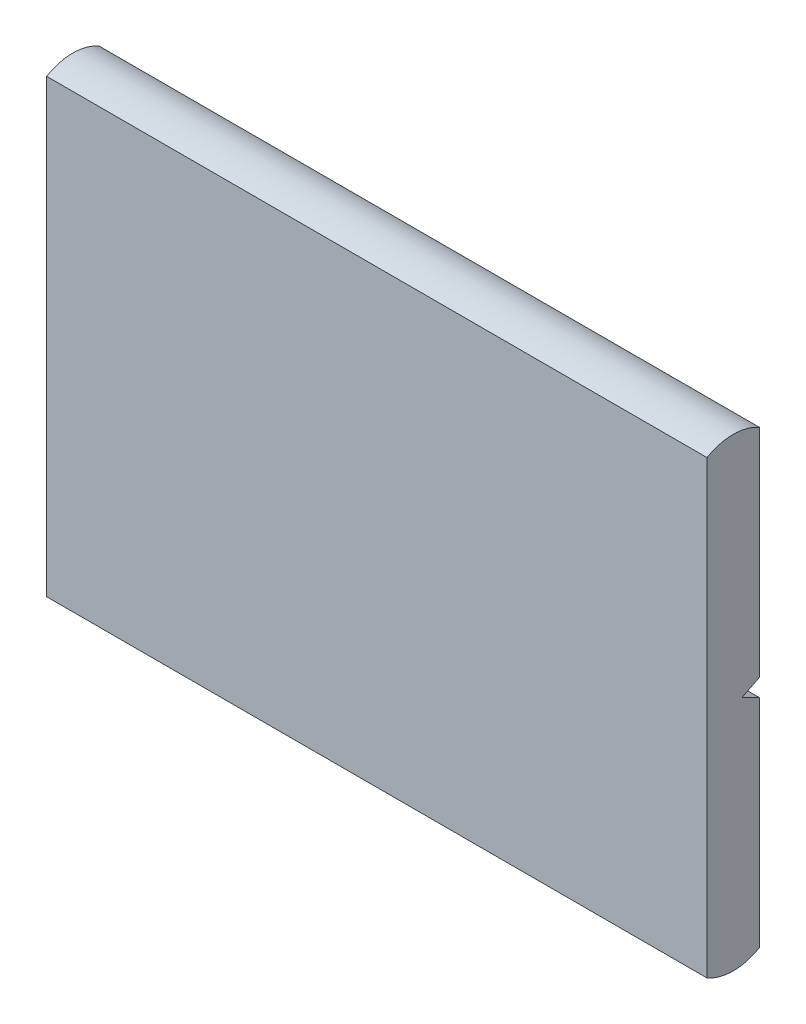
ISO-10303-21;
HEADER;
FILE_DESCRIPTION(('STEP AP214'),'2;1');
FILE_NAME('part.step','',(''),(''),'','','');
FILE_SCHEMA(('AUTOMOTIVE_DESIGN { 1 0 10303 214 1 1 1 1 }'));
ENDSEC;
DATA;
#1=APPLICATION_CONTEXT('core data for automotive mechanical design processes');
#2=APPLICATION_PROTOCOL_DEFINITION('international standard','automotive_design',2000,#1);
#3=PRODUCT_CONTEXT('',#1,'mechanical');
#4=PRODUCT('Part','Part','',(#3));
#5=PRODUCT_RELATED_PRODUCT_CATEGORY('part','',(#4));
#6=PRODUCT_DEFINITION_FORMATION('','',#4);
#7=PRODUCT_DEFINITION_CONTEXT('part definition',#1,'design');
#8=PRODUCT_DEFINITION('design','',#6,#7);
#9=PRODUCT_DEFINITION_SHAPE('','',#8);
#10=(LENGTH_UNIT() NAMED_UNIT(*) SI_UNIT(.MILLI.,.METRE.));
#11=(NAMED_UNIT(*) PLANE_ANGLE_UNIT() SI_UNIT($,.RADIAN.));
#12=(NAMED_UNIT(*) SI_UNIT($,.STERADIAN.) SOLID_ANGLE_UNIT());
#13=UNCERTAINTY_MEASURE_WITH_UNIT(LENGTH_MEASURE(1.E-05),#10,'distance_accuracy_value','');
#14=(GEOMETRIC_REPRESENTATION_CONTEXT(3) GLOBAL_UNCERTAINTY_ASSIGNED_CONTEXT((#13)) GLOBAL_UNIT_ASSIGNED_CONTEXT((#10,
#11,#12)) REPRESENTATION_CONTEXT('',''));
#15=CARTESIAN_POINT('',(0.,0.,0.));
#16=DIRECTION('',(0.,0.,1.));
#17=DIRECTION('',(1.,0.,0.));
#18=AXIS2_PLACEMENT_3D('',#15,#16,#17);
#19=CARTESIAN_POINT('',(-6.9,15.8207913991634,6.95841720167324));
#20=DIRECTION('',(0.,-0.894427190999916,-0.447213595499958));
#21=DIRECTION('',(0.,0.447213595499958,-0.894427190999916));
#22=AXIS2_PLACEMENT_3D('',#19,#20,#21);
#23=PLANE('',#22);
#24=DIRECTION('',(0.,0.447213595499958,-0.894427190999916));
#25=VECTOR('',#24,1.);
#26=CARTESIAN_POINT('',(-6.9,15.8207913991634,6.95841720167324));
#27=LINE('',#26,#25);
#28=CARTESIAN_POINT('',(-6.9,11.7,15.2));
#29=VERTEX_POINT('',#28);
#30=CARTESIAN_POINT('',(-6.9,11.95,14.7));
#31=VERTEX_POINT('',#30);
#32=EDGE_CURVE('E60',#29,#31,#27,.T.);
#33=ORIENTED_EDGE('',*,*,#32,.T.);
#34=DIRECTION('',(1.,0.,0.));
#35=VECTOR('',#34,1.);
#36=CARTESIAN_POINT('',(12.,11.95,14.7));
#37=LINE('',#36,#35);
#38=CARTESIAN_POINT('',(12.,11.95,14.7));
#39=VERTEX_POINT('',#38);
#40=EDGE_CURVE('E103',#31,#39,#37,.T.);
#41=ORIENTED_EDGE('',*,*,#40,.T.);
#42=DIRECTION('',(0.,0.447213595499958,-0.894427190999916));
#43=VECTOR('',#42,1.);
#44=CARTESIAN_POINT('',(12.,15.8207913991634,6.95841720167324));
#45=LINE('',#44,#43);
#46=CARTESIAN_POINT('',(12.,11.7,15.2));
#47=VERTEX_POINT('',#46);
#48=EDGE_CURVE('E148',#39,#47,#45,.F.);
#49=ORIENTED_EDGE('',*,*,#48,.T.);
#50=DIRECTION('',(1.,0.,0.));
#51=VECTOR('',#50,1.);
#52=CARTESIAN_POINT('',(-6.9,11.7,15.2));
#53=LINE('',#52,#51);
#54=EDGE_CURVE('E98',#29,#47,#53,.T.);
#55=ORIENTED_EDGE('',*,*,#54,.F.);
#56=EDGE_LOOP('',(#33,#41,#49,#55));
#57=FACE_BOUND('',#56,.T.);
#58=ADVANCED_FACE('F17',(#57),#23,.T.);
#59=CARTESIAN_POINT('',(-6.9,7.57920860083662,6.95841720167324));
#60=DIRECTION('',(0.,0.894427190999916,-0.447213595499958));
#61=DIRECTION('',(0.,0.447213595499958,0.894427190999916));
#62=AXIS2_PLACEMENT_3D('',#59,#60,#61);
#63=PLANE('',#62);
#64=DIRECTION('',(0.,0.447213595499958,0.894427190999916));
#65=VECTOR('',#64,1.);
#66=CARTESIAN_POINT('',(-6.9,7.57920860083662,6.95841720167324));
#67=LINE('',#66,#65);
#68=CARTESIAN_POINT('',(-6.9,11.45,14.7));
#69=VERTEX_POINT('',#68);
#70=EDGE_CURVE('E100',#69,#29,#67,.T.);
#71=ORIENTED_EDGE('',*,*,#70,.T.);
#72=ORIENTED_EDGE('',*,*,#54,.T.);
#73=DIRECTION('',(0.,0.447213595499958,0.894427190999916));
#74=VECTOR('',#73,1.);
#75=CARTESIAN_POINT('',(12.,7.57920860083662,6.95841720167324));
#76=LINE('',#75,#74);
#77=CARTESIAN_POINT('',(12.,11.45,14.7));
#78=VERTEX_POINT('',#77);
#79=EDGE_CURVE('E95',#47,#78,#76,.F.);
#80=ORIENTED_EDGE('',*,*,#79,.T.);
#81=DIRECTION('',(1.,0.,0.));
#82=VECTOR('',#81,1.);
#83=CARTESIAN_POINT('',(12.,11.45,14.7));
#84=LINE('',#83,#82);
#85=EDGE_CURVE('E97',#78,#69,#84,.F.);
#86=ORIENTED_EDGE('',*,*,#85,.T.);
#87=EDGE_LOOP('',(#71,#72,#80,#86));
#88=FACE_BOUND('',#87,.T.);
#89=ADVANCED_FACE('F96',(#88),#63,.T.);
#90=CARTESIAN_POINT('',(12.,5.05,14.7));
#91=DIRECTION('',(0.,0.,1.));
#92=DIRECTION('',(1.,0.,0.));
#93=AXIS2_PLACEMENT_3D('',#90,#91,#92);
#94=PLANE('',#93);
#95=DIRECTION('',(0.,1.,0.));
#96=VECTOR('',#95,1.);
#97=CARTESIAN_POINT('',(12.,18.35,14.7));
#98=LINE('',#97,#96);
#99=CARTESIAN_POINT('',(12.,18.1490381056767,14.7));
#100=VERTEX_POINT('',#99);
#101=EDGE_CURVE('E107',#100,#39,#98,.F.);
#102=ORIENTED_EDGE('',*,*,#101,.T.);
#103=ORIENTED_EDGE('',*,*,#40,.F.);
#104=DIRECTION('',(0.,1.,0.));
#105=VECTOR('',#104,1.);
#106=CARTESIAN_POINT('',(-6.9,18.35,14.7));
#107=LINE('',#106,#105);
#108=CARTESIAN_POINT('',(-6.9,18.1490381056767,14.7));
#109=VERTEX_POINT('',#108);
#110=EDGE_CURVE('E127',#109,#31,#107,.F.);
#111=ORIENTED_EDGE('',*,*,#110,.F.);
#112=DIRECTION('',(-1.,0.,0.));
#113=VECTOR('',#112,1.);
#114=CARTESIAN_POINT('',(-6.9,18.1490381056767,14.7));
#115=LINE('',#114,#113);
#116=EDGE_CURVE('E51',#100,#109,#115,.T.);
#117=ORIENTED_EDGE('',*,*,#116,.F.);
#118=EDGE_LOOP('',(#102,#103,#111,#117));
#119=FACE_BOUND('',#118,.T.);
#120=ADVANCED_FACE('F167',(#119),#94,.F.);
#121=CARTESIAN_POINT('',(12.,5.05,14.7));
#122=DIRECTION('',(0.,0.,1.));
#123=DIRECTION('',(1.,0.,0.));
#124=AXIS2_PLACEMENT_3D('',#121,#122,#123);
#125=PLANE('',#124);
#126=DIRECTION('',(0.,1.,0.));
#127=VECTOR('',#126,1.);
#128=CARTESIAN_POINT('',(-6.9,18.35,14.7));
#129=LINE('',#128,#127);
#130=CARTESIAN_POINT('',(-6.9,5.25096189432335,14.7));
#131=VERTEX_POINT('',#130);
#132=EDGE_CURVE('E82',#69,#131,#129,.F.);
#133=ORIENTED_EDGE('',*,*,#132,.F.);
#134=ORIENTED_EDGE('',*,*,#85,.F.);
#135=DIRECTION('',(0.,1.,0.));
#136=VECTOR('',#135,1.);
#137=CARTESIAN_POINT('',(12.,18.35,14.7));
#138=LINE('',#137,#136);
#139=CARTESIAN_POINT('',(12.,5.25096189432335,14.7));
#140=VERTEX_POINT('',#139);
#141=EDGE_CURVE('E89',#78,#140,#138,.F.);
#142=ORIENTED_EDGE('',*,*,#141,.T.);
#143=DIRECTION('',(-1.,0.,0.));
#144=VECTOR('',#143,1.);
#145=CARTESIAN_POINT('',(-6.9,5.25096189432335,14.7));
#146=LINE('',#145,#144);
#147=EDGE_CURVE('E126',#131,#140,#146,.F.);
#148=ORIENTED_EDGE('',*,*,#147,.F.);
#149=EDGE_LOOP('',(#133,#134,#142,#148));
#150=FACE_BOUND('',#149,.T.);
#151=ADVANCED_FACE('F102',(#150),#125,.F.);
#152=CARTESIAN_POINT('',(-6.9,18.35,14.7));
#153=DIRECTION('',(-1.,0.,0.));
#154=DIRECTION('',(0.,0.,1.));
#155=AXIS2_PLACEMENT_3D('',#152,#153,#154);
#156=PLANE('',#155);
#157=ORIENTED_EDGE('',*,*,#32,.F.);
#158=ORIENTED_EDGE('',*,*,#70,.F.);
#159=ORIENTED_EDGE('',*,*,#132,.T.);
#160=CARTESIAN_POINT('',(-6.9,6.55,15.45));
#161=DIRECTION('',(-1.,0.,0.));
#162=DIRECTION('',(0.,0.,1.));
#163=AXIS2_PLACEMENT_3D('',#160,#161,#162);
#164=CIRCLE('',#163,1.5);
#165=CARTESIAN_POINT('',(-6.9,5.25096189432334,16.2));
#166=VERTEX_POINT('',#165);
#167=EDGE_CURVE('E109',#166,#131,#164,.F.);
#168=ORIENTED_EDGE('',*,*,#167,.F.);
#169=DIRECTION('',(0.,1.,0.));
#170=VECTOR('',#169,1.);
#171=CARTESIAN_POINT('',(-6.9,5.05,16.2));
#172=LINE('',#171,#170);
#173=CARTESIAN_POINT('',(-6.9,18.1490381056767,16.2));
#174=VERTEX_POINT('',#173);
#175=EDGE_CURVE('E122',#166,#174,#172,.T.);
#176=ORIENTED_EDGE('',*,*,#175,.T.);
#177=CARTESIAN_POINT('',(-6.9,16.85,15.45));
#178=DIRECTION('',(-1.,0.,0.));
#179=DIRECTION('',(0.,0.,1.));
#180=AXIS2_PLACEMENT_3D('',#177,#178,#179);
#181=CIRCLE('',#180,1.5);
#182=EDGE_CURVE('E20',#109,#174,#181,.F.);
#183=ORIENTED_EDGE('',*,*,#182,.F.);
#184=ORIENTED_EDGE('',*,*,#110,.T.);
#185=EDGE_LOOP('',(#157,#158,#159,#168,#176,#183,#184));
#186=FACE_BOUND('',#185,.T.);
#187=ADVANCED_FACE('F163',(#186),#156,.T.);
#188=CARTESIAN_POINT('',(-6.9,16.85,15.45));
#189=DIRECTION('',(-1.,0.,0.));
#190=DIRECTION('',(0.,0.,1.));
#191=AXIS2_PLACEMENT_3D('',#188,#189,#190);
#192=CYLINDRICAL_SURFACE('',#191,1.5);
#193=ORIENTED_EDGE('',*,*,#182,.T.);
#194=DIRECTION('',(-1.,0.,0.));
#195=VECTOR('',#194,1.);
#196=CARTESIAN_POINT('',(12.,18.1490381056767,16.2));
#197=LINE('',#196,#195);
#198=CARTESIAN_POINT('',(12.,18.1490381056767,16.2));
#199=VERTEX_POINT('',#198);
#200=EDGE_CURVE('E119',#174,#199,#197,.F.);
#201=ORIENTED_EDGE('',*,*,#200,.T.);
#202=CARTESIAN_POINT('',(12.,16.85,15.45));
#203=DIRECTION('',(-1.,0.,0.));
#204=DIRECTION('',(0.,0.,1.));
#205=AXIS2_PLACEMENT_3D('',#202,#203,#204);
#206=CIRCLE('',#205,1.5);
#207=EDGE_CURVE('E112',#199,#100,#206,.T.);
#208=ORIENTED_EDGE('',*,*,#207,.T.);
#209=ORIENTED_EDGE('',*,*,#116,.T.);
#210=EDGE_LOOP('',(#193,#201,#208,#209));
#211=FACE_BOUND('',#210,.T.);
#212=ADVANCED_FACE('F159',(#211),#192,.T.);
#213=CARTESIAN_POINT('',(12.,18.35,14.7));
#214=DIRECTION('',(-1.,0.,0.));
#215=DIRECTION('',(0.,0.,1.));
#216=AXIS2_PLACEMENT_3D('',#213,#214,#215);
#217=PLANE('',#216);
#218=ORIENTED_EDGE('',*,*,#141,.F.);
#219=ORIENTED_EDGE('',*,*,#79,.F.);
#220=ORIENTED_EDGE('',*,*,#48,.F.);
#221=ORIENTED_EDGE('',*,*,#101,.F.);
#222=ORIENTED_EDGE('',*,*,#207,.F.);
#223=DIRECTION('',(0.,1.,0.));
#224=VECTOR('',#223,1.);
#225=CARTESIAN_POINT('',(12.,5.05,16.2));
#226=LINE('',#225,#224);
#227=CARTESIAN_POINT('',(12.,5.25096189432334,16.2));
#228=VERTEX_POINT('',#227);
#229=EDGE_CURVE('E26',#199,#228,#226,.F.);
#230=ORIENTED_EDGE('',*,*,#229,.T.);
#231=CARTESIAN_POINT('',(12.,6.55,15.45));
#232=DIRECTION('',(-1.,0.,0.));
#233=DIRECTION('',(0.,0.,1.));
#234=AXIS2_PLACEMENT_3D('',#231,#232,#233);
#235=CIRCLE('',#234,1.5);
#236=EDGE_CURVE('E34',#140,#228,#235,.T.);
#237=ORIENTED_EDGE('',*,*,#236,.F.);
#238=EDGE_LOOP('',(#218,#219,#220,#221,#222,#230,#237));
#239=FACE_BOUND('',#238,.T.);
#240=ADVANCED_FACE('F105',(#239),#217,.F.);
#241=CARTESIAN_POINT('',(-6.9,6.55,15.45));
#242=DIRECTION('',(-1.,0.,0.));
#243=DIRECTION('',(0.,0.,1.));
#244=AXIS2_PLACEMENT_3D('',#241,#242,#243);
#245=CYLINDRICAL_SURFACE('',#244,1.5);
#246=ORIENTED_EDGE('',*,*,#167,.T.);
#247=ORIENTED_EDGE('',*,*,#147,.T.);
#248=ORIENTED_EDGE('',*,*,#236,.T.);
#249=DIRECTION('',(-1.,0.,0.));
#250=VECTOR('',#249,1.);
#251=CARTESIAN_POINT('',(12.,5.25096189432334,16.2));
#252=LINE('',#251,#250);
#253=EDGE_CURVE('E11',#228,#166,#252,.T.);
#254=ORIENTED_EDGE('',*,*,#253,.T.);
#255=EDGE_LOOP('',(#246,#247,#248,#254));
#256=FACE_BOUND('',#255,.T.);
#257=ADVANCED_FACE('F164',(#256),#245,.T.);
#258=CARTESIAN_POINT('',(12.,5.05,16.2));
#259=DIRECTION('',(0.,0.,-1.));
#260=DIRECTION('',(-1.,0.,0.));
#261=AXIS2_PLACEMENT_3D('',#258,#259,#260);
#262=PLANE('',#261);
#263=ORIENTED_EDGE('',*,*,#229,.F.);
#264=ORIENTED_EDGE('',*,*,#200,.F.);
#265=ORIENTED_EDGE('',*,*,#175,.F.);
#266=ORIENTED_EDGE('',*,*,#253,.F.);
#267=EDGE_LOOP('',(#263,#264,#265,#266));
#268=FACE_BOUND('',#267,.T.);
#269=ADVANCED_FACE('F162',(#268),#262,.F.);
#270=CLOSED_SHELL('',(#58,#89,#120,#151,#187,#212,#240,#257,#269));
#271=MANIFOLD_SOLID_BREP('B1',#270);
#272=ADVANCED_BREP_SHAPE_REPRESENTATION('',(#18,#271),#14);
#273=SHAPE_DEFINITION_REPRESENTATION(#9,#272);
ENDSEC;
END-ISO-10303-21;
